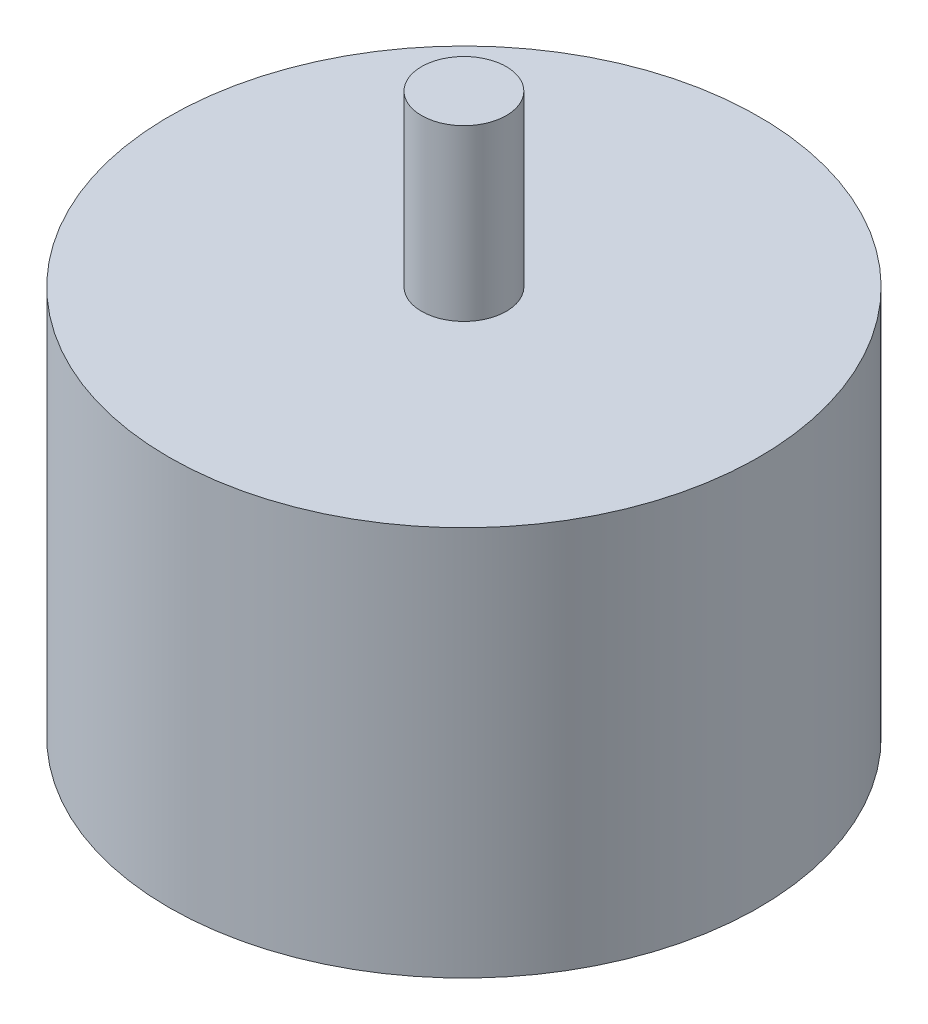
ISO-10303-21;
HEADER;
FILE_DESCRIPTION(('STEP AP214'),'2;1');
FILE_NAME('part.step','',(''),(''),'','','');
FILE_SCHEMA(('AUTOMOTIVE_DESIGN { 1 0 10303 214 1 1 1 1 }'));
ENDSEC;
DATA;
#1=APPLICATION_CONTEXT('core data for automotive mechanical design processes');
#2=APPLICATION_PROTOCOL_DEFINITION('international standard','automotive_design',2000,#1);
#3=PRODUCT_CONTEXT('',#1,'mechanical');
#4=PRODUCT('Part','Part','',(#3));
#5=PRODUCT_RELATED_PRODUCT_CATEGORY('part','',(#4));
#6=PRODUCT_DEFINITION_FORMATION('','',#4);
#7=PRODUCT_DEFINITION_CONTEXT('part definition',#1,'design');
#8=PRODUCT_DEFINITION('design','',#6,#7);
#9=PRODUCT_DEFINITION_SHAPE('','',#8);
#10=(LENGTH_UNIT() NAMED_UNIT(*) SI_UNIT(.MILLI.,.METRE.));
#11=(NAMED_UNIT(*) PLANE_ANGLE_UNIT() SI_UNIT($,.RADIAN.));
#12=(NAMED_UNIT(*) SI_UNIT($,.STERADIAN.) SOLID_ANGLE_UNIT());
#13=UNCERTAINTY_MEASURE_WITH_UNIT(LENGTH_MEASURE(1.E-05),#10,'distance_accuracy_value','');
#14=(GEOMETRIC_REPRESENTATION_CONTEXT(3) GLOBAL_UNCERTAINTY_ASSIGNED_CONTEXT((#13)) GLOBAL_UNIT_ASSIGNED_CONTEXT((#10,
#11,#12)) REPRESENTATION_CONTEXT('',''));
#15=CARTESIAN_POINT('',(0.,0.,0.));
#16=DIRECTION('',(0.,0.,1.));
#17=DIRECTION('',(1.,0.,0.));
#18=AXIS2_PLACEMENT_3D('',#15,#16,#17);
#19=CARTESIAN_POINT('',(0.,0.,0.));
#20=DIRECTION('',(0.,1.,0.));
#21=DIRECTION('',(0.,0.,1.));
#22=AXIS2_PLACEMENT_3D('',#19,#20,#21);
#23=PLANE('',#22);
#24=CARTESIAN_POINT('',(0.,0.,-12.5000004));
#25=DIRECTION('',(0.,-1.,0.));
#26=DIRECTION('',(0.,0.,1.));
#27=AXIS2_PLACEMENT_3D('',#24,#25,#26);
#28=CIRCLE('',#27,1.524);
#29=CARTESIAN_POINT('',(0.,0.,-10.9760004));
#30=VERTEX_POINT('',#29);
#31=EDGE_CURVE('E75',#30,#30,#28,.T.);
#32=ORIENTED_EDGE('',*,*,#31,.F.);
#33=EDGE_LOOP('',(#32));
#34=FACE_BOUND('',#33,.T.);
#35=CARTESIAN_POINT('',(-9.4999937,0.,0.));
#36=DIRECTION('',(0.,-1.,0.));
#37=DIRECTION('',(0.,0.,1.));
#38=AXIS2_PLACEMENT_3D('',#35,#36,#37);
#39=CIRCLE('',#38,1.5);
#40=CARTESIAN_POINT('',(-9.4999937,0.,1.5));
#41=VERTEX_POINT('',#40);
#42=EDGE_CURVE('E69',#41,#41,#39,.T.);
#43=ORIENTED_EDGE('',*,*,#42,.F.);
#44=EDGE_LOOP('',(#43));
#45=FACE_BOUND('',#44,.T.);
#46=CARTESIAN_POINT('',(9.4999937,0.,0.));
#47=DIRECTION('',(0.,-1.,0.));
#48=DIRECTION('',(0.,0.,-1.));
#49=AXIS2_PLACEMENT_3D('',#46,#47,#48);
#50=CIRCLE('',#49,1.5);
#51=CARTESIAN_POINT('',(9.4999937,0.,-1.5));
#52=VERTEX_POINT('',#51);
#53=EDGE_CURVE('E63',#52,#52,#50,.T.);
#54=ORIENTED_EDGE('',*,*,#53,.F.);
#55=EDGE_LOOP('',(#54));
#56=FACE_BOUND('',#55,.T.);
#57=CARTESIAN_POINT('',(0.,0.,12.5000004));
#58=DIRECTION('',(0.,-1.,0.));
#59=DIRECTION('',(0.,0.,-1.));
#60=AXIS2_PLACEMENT_3D('',#57,#58,#59);
#61=CIRCLE('',#60,1.524);
#62=CARTESIAN_POINT('',(0.,0.,10.9760004));
#63=VERTEX_POINT('',#62);
#64=EDGE_CURVE('E57',#63,#63,#61,.T.);
#65=ORIENTED_EDGE('',*,*,#64,.F.);
#66=EDGE_LOOP('',(#65));
#67=FACE_BOUND('',#66,.T.);
#68=CARTESIAN_POINT('',(0.,0.,0.));
#69=DIRECTION('',(0.,1.,0.));
#70=DIRECTION('',(0.,0.,1.));
#71=AXIS2_PLACEMENT_3D('',#68,#69,#70);
#72=CIRCLE('',#71,17.399);
#73=CARTESIAN_POINT('',(0.,0.,17.399));
#74=VERTEX_POINT('',#73);
#75=EDGE_CURVE('E41',#74,#74,#72,.T.);
#76=ORIENTED_EDGE('',*,*,#75,.F.);
#77=EDGE_LOOP('',(#76));
#78=FACE_BOUND('',#77,.T.);
#79=CARTESIAN_POINT('',(0.,0.,0.));
#80=DIRECTION('',(0.,1.,0.));
#81=DIRECTION('',(0.,0.,1.));
#82=AXIS2_PLACEMENT_3D('',#79,#80,#81);
#83=CIRCLE('',#82,1.499997);
#84=CARTESIAN_POINT('',(0.,0.,1.499997));
#85=VERTEX_POINT('',#84);
#86=EDGE_CURVE('E10',#85,#85,#83,.F.);
#87=ORIENTED_EDGE('',*,*,#86,.F.);
#88=EDGE_LOOP('',(#87));
#89=FACE_BOUND('',#88,.T.);
#90=ADVANCED_FACE('F30',(#34,#45,#56,#67,#78,#89),#23,.F.);
#91=CARTESIAN_POINT('',(0.,23.0000048,0.));
#92=DIRECTION('',(0.,1.,0.));
#93=DIRECTION('',(0.,0.,1.));
#94=AXIS2_PLACEMENT_3D('',#91,#92,#93);
#95=PLANE('',#94);
#96=CARTESIAN_POINT('',(0.,23.0000048,0.));
#97=DIRECTION('',(0.,1.,0.));
#98=DIRECTION('',(0.,0.,1.));
#99=AXIS2_PLACEMENT_3D('',#96,#97,#98);
#100=CIRCLE('',#99,17.399);
#101=CARTESIAN_POINT('',(0.,23.0000048,17.399));
#102=VERTEX_POINT('',#101);
#103=EDGE_CURVE('E37',#102,#102,#100,.T.);
#104=ORIENTED_EDGE('',*,*,#103,.T.);
#105=EDGE_LOOP('',(#104));
#106=FACE_BOUND('',#105,.T.);
#107=CARTESIAN_POINT('',(0.,23.0000048,0.));
#108=DIRECTION('',(0.,1.,0.));
#109=DIRECTION('',(0.,0.,1.));
#110=AXIS2_PLACEMENT_3D('',#107,#108,#109);
#111=CIRCLE('',#110,2.5);
#112=CARTESIAN_POINT('',(0.,23.0000048,2.5));
#113=VERTEX_POINT('',#112);
#114=EDGE_CURVE('E48',#113,#113,#111,.T.);
#115=ORIENTED_EDGE('',*,*,#114,.F.);
#116=EDGE_LOOP('',(#115));
#117=FACE_BOUND('',#116,.T.);
#118=ADVANCED_FACE('F92',(#106,#117),#95,.T.);
#119=CARTESIAN_POINT('',(0.,23.0000048,0.));
#120=DIRECTION('',(0.,-1.,0.));
#121=DIRECTION('',(0.,0.,-1.));
#122=AXIS2_PLACEMENT_3D('',#119,#120,#121);
#123=CYLINDRICAL_SURFACE('',#122,17.399);
#124=ORIENTED_EDGE('',*,*,#103,.F.);
#125=EDGE_LOOP('',(#124));
#126=FACE_BOUND('',#125,.T.);
#127=ORIENTED_EDGE('',*,*,#75,.T.);
#128=EDGE_LOOP('',(#127));
#129=FACE_BOUND('',#128,.T.);
#130=ADVANCED_FACE('F32',(#126,#129),#123,.T.);
#131=CARTESIAN_POINT('',(0.,33.0000048,0.));
#132=DIRECTION('',(0.,-1.,0.));
#133=DIRECTION('',(0.,0.,-1.));
#134=AXIS2_PLACEMENT_3D('',#131,#132,#133);
#135=CYLINDRICAL_SURFACE('',#134,2.5);
#136=CARTESIAN_POINT('',(0.,33.0000048,0.));
#137=DIRECTION('',(0.,1.,0.));
#138=DIRECTION('',(0.,0.,1.));
#139=AXIS2_PLACEMENT_3D('',#136,#137,#138);
#140=CIRCLE('',#139,2.5);
#141=CARTESIAN_POINT('',(0.,33.0000048,2.5));
#142=VERTEX_POINT('',#141);
#143=EDGE_CURVE('E46',#142,#142,#140,.T.);
#144=ORIENTED_EDGE('',*,*,#143,.F.);
#145=EDGE_LOOP('',(#144));
#146=FACE_BOUND('',#145,.T.);
#147=ORIENTED_EDGE('',*,*,#114,.T.);
#148=EDGE_LOOP('',(#147));
#149=FACE_BOUND('',#148,.T.);
#150=ADVANCED_FACE('F103',(#146,#149),#135,.T.);
#151=CARTESIAN_POINT('',(0.,33.0000048,0.));
#152=DIRECTION('',(0.,1.,0.));
#153=DIRECTION('',(0.,0.,1.));
#154=AXIS2_PLACEMENT_3D('',#151,#152,#153);
#155=PLANE('',#154);
#156=ORIENTED_EDGE('',*,*,#143,.T.);
#157=EDGE_LOOP('',(#156));
#158=FACE_BOUND('',#157,.T.);
#159=ADVANCED_FACE('F109',(#158),#155,.T.);
#160=CARTESIAN_POINT('',(0.,-2.,0.));
#161=DIRECTION('',(0.,1.,0.));
#162=DIRECTION('',(0.,0.,1.));
#163=AXIS2_PLACEMENT_3D('',#160,#161,#162);
#164=CYLINDRICAL_SURFACE('',#163,1.499997);
#165=CARTESIAN_POINT('',(0.,-2.,0.));
#166=DIRECTION('',(0.,-1.,0.));
#167=DIRECTION('',(0.,0.,-1.));
#168=AXIS2_PLACEMENT_3D('',#165,#166,#167);
#169=CIRCLE('',#168,1.499997);
#170=CARTESIAN_POINT('',(0.,-2.,-1.499997));
#171=VERTEX_POINT('',#170);
#172=EDGE_CURVE('E51',#171,#171,#169,.T.);
#173=ORIENTED_EDGE('',*,*,#172,.F.);
#174=EDGE_LOOP('',(#173));
#175=FACE_BOUND('',#174,.T.);
#176=ORIENTED_EDGE('',*,*,#86,.T.);
#177=EDGE_LOOP('',(#176));
#178=FACE_BOUND('',#177,.T.);
#179=ADVANCED_FACE('F119',(#175,#178),#164,.T.);
#180=CARTESIAN_POINT('',(0.,-2.,0.));
#181=DIRECTION('',(0.,-1.,0.));
#182=DIRECTION('',(0.,0.,-1.));
#183=AXIS2_PLACEMENT_3D('',#180,#181,#182);
#184=PLANE('',#183);
#185=ORIENTED_EDGE('',*,*,#172,.T.);
#186=EDGE_LOOP('',(#185));
#187=FACE_BOUND('',#186,.T.);
#188=ADVANCED_FACE('F123',(#187),#184,.T.);
#189=CARTESIAN_POINT('',(0.,2.,12.5000004));
#190=DIRECTION('',(0.,-1.,0.));
#191=DIRECTION('',(0.,0.,-1.));
#192=AXIS2_PLACEMENT_3D('',#189,#190,#191);
#193=CYLINDRICAL_SURFACE('',#192,1.524);
#194=CARTESIAN_POINT('',(0.,2.,12.5000004));
#195=DIRECTION('',(0.,-1.,0.));
#196=DIRECTION('',(0.,0.,-1.));
#197=AXIS2_PLACEMENT_3D('',#194,#195,#196);
#198=CIRCLE('',#197,1.524);
#199=CARTESIAN_POINT('',(0.,2.,10.9760004));
#200=VERTEX_POINT('',#199);
#201=EDGE_CURVE('E56',#200,#200,#198,.T.);
#202=ORIENTED_EDGE('',*,*,#201,.F.);
#203=EDGE_LOOP('',(#202));
#204=FACE_BOUND('',#203,.T.);
#205=ORIENTED_EDGE('',*,*,#64,.T.);
#206=EDGE_LOOP('',(#205));
#207=FACE_BOUND('',#206,.T.);
#208=ADVANCED_FACE('F127',(#204,#207),#193,.F.);
#209=CARTESIAN_POINT('',(0.,2.,12.5000004));
#210=DIRECTION('',(0.,-1.,0.));
#211=DIRECTION('',(0.,0.,-1.));
#212=AXIS2_PLACEMENT_3D('',#209,#210,#211);
#213=PLANE('',#212);
#214=ORIENTED_EDGE('',*,*,#201,.T.);
#215=EDGE_LOOP('',(#214));
#216=FACE_BOUND('',#215,.T.);
#217=ADVANCED_FACE('F131',(#216),#213,.T.);
#218=CARTESIAN_POINT('',(9.4999937,2.,0.));
#219=DIRECTION('',(0.,-1.,0.));
#220=DIRECTION('',(0.,0.,-1.));
#221=AXIS2_PLACEMENT_3D('',#218,#219,#220);
#222=CYLINDRICAL_SURFACE('',#221,1.5);
#223=CARTESIAN_POINT('',(9.4999937,2.,0.));
#224=DIRECTION('',(0.,-1.,0.));
#225=DIRECTION('',(0.,0.,-1.));
#226=AXIS2_PLACEMENT_3D('',#223,#224,#225);
#227=CIRCLE('',#226,1.5);
#228=CARTESIAN_POINT('',(9.4999937,2.,-1.5));
#229=VERTEX_POINT('',#228);
#230=EDGE_CURVE('E60',#229,#229,#227,.T.);
#231=ORIENTED_EDGE('',*,*,#230,.F.);
#232=EDGE_LOOP('',(#231));
#233=FACE_BOUND('',#232,.T.);
#234=ORIENTED_EDGE('',*,*,#53,.T.);
#235=EDGE_LOOP('',(#234));
#236=FACE_BOUND('',#235,.T.);
#237=ADVANCED_FACE('F135',(#233,#236),#222,.F.);
#238=CARTESIAN_POINT('',(9.4999937,2.,0.));
#239=DIRECTION('',(0.,-1.,0.));
#240=DIRECTION('',(0.,0.,-1.));
#241=AXIS2_PLACEMENT_3D('',#238,#239,#240);
#242=PLANE('',#241);
#243=ORIENTED_EDGE('',*,*,#230,.T.);
#244=EDGE_LOOP('',(#243));
#245=FACE_BOUND('',#244,.T.);
#246=ADVANCED_FACE('F139',(#245),#242,.T.);
#247=CARTESIAN_POINT('',(-9.4999937,2.,0.));
#248=DIRECTION('',(0.,-1.,0.));
#249=DIRECTION('',(0.,0.,-1.));
#250=AXIS2_PLACEMENT_3D('',#247,#248,#249);
#251=CYLINDRICAL_SURFACE('',#250,1.5);
#252=CARTESIAN_POINT('',(-9.4999937,2.,0.));
#253=DIRECTION('',(0.,-1.,0.));
#254=DIRECTION('',(0.,0.,1.));
#255=AXIS2_PLACEMENT_3D('',#252,#253,#254);
#256=CIRCLE('',#255,1.5);
#257=CARTESIAN_POINT('',(-9.4999937,2.,1.5));
#258=VERTEX_POINT('',#257);
#259=EDGE_CURVE('E66',#258,#258,#256,.T.);
#260=ORIENTED_EDGE('',*,*,#259,.F.);
#261=EDGE_LOOP('',(#260));
#262=FACE_BOUND('',#261,.T.);
#263=ORIENTED_EDGE('',*,*,#42,.T.);
#264=EDGE_LOOP('',(#263));
#265=FACE_BOUND('',#264,.T.);
#266=ADVANCED_FACE('F143',(#262,#265),#251,.F.);
#267=CARTESIAN_POINT('',(-9.4999937,2.,0.));
#268=DIRECTION('',(0.,1.,0.));
#269=DIRECTION('',(0.,0.,1.));
#270=AXIS2_PLACEMENT_3D('',#267,#268,#269);
#271=PLANE('',#270);
#272=ORIENTED_EDGE('',*,*,#259,.T.);
#273=EDGE_LOOP('',(#272));
#274=FACE_BOUND('',#273,.T.);
#275=ADVANCED_FACE('F86',(#274),#271,.F.);
#276=CARTESIAN_POINT('',(0.,2.,-12.5000004));
#277=DIRECTION('',(0.,-1.,0.));
#278=DIRECTION('',(0.,0.,-1.));
#279=AXIS2_PLACEMENT_3D('',#276,#277,#278);
#280=CYLINDRICAL_SURFACE('',#279,1.524);
#281=CARTESIAN_POINT('',(0.,2.,-12.5000004));
#282=DIRECTION('',(0.,-1.,0.));
#283=DIRECTION('',(0.,0.,1.));
#284=AXIS2_PLACEMENT_3D('',#281,#282,#283);
#285=CIRCLE('',#284,1.524);
#286=CARTESIAN_POINT('',(0.,2.,-10.9760004));
#287=VERTEX_POINT('',#286);
#288=EDGE_CURVE('E72',#287,#287,#285,.T.);
#289=ORIENTED_EDGE('',*,*,#288,.F.);
#290=EDGE_LOOP('',(#289));
#291=FACE_BOUND('',#290,.T.);
#292=ORIENTED_EDGE('',*,*,#31,.T.);
#293=EDGE_LOOP('',(#292));
#294=FACE_BOUND('',#293,.T.);
#295=ADVANCED_FACE('F83',(#291,#294),#280,.F.);
#296=CARTESIAN_POINT('',(0.,2.,-12.5000004));
#297=DIRECTION('',(0.,1.,0.));
#298=DIRECTION('',(0.,0.,1.));
#299=AXIS2_PLACEMENT_3D('',#296,#297,#298);
#300=PLANE('',#299);
#301=ORIENTED_EDGE('',*,*,#288,.T.);
#302=EDGE_LOOP('',(#301));
#303=FACE_BOUND('',#302,.T.);
#304=ADVANCED_FACE('F81',(#303),#300,.F.);
#305=CLOSED_SHELL('',(#90,#118,#130,#150,#159,#179,#188,#208,#217,#237,#246,#266,#275,#295,#304));
#306=MANIFOLD_SOLID_BREP('B2',#305);
#307=ADVANCED_BREP_SHAPE_REPRESENTATION('',(#18,#306),#14);
#308=SHAPE_DEFINITION_REPRESENTATION(#9,#307);
ENDSEC;
END-ISO-10303-21;
